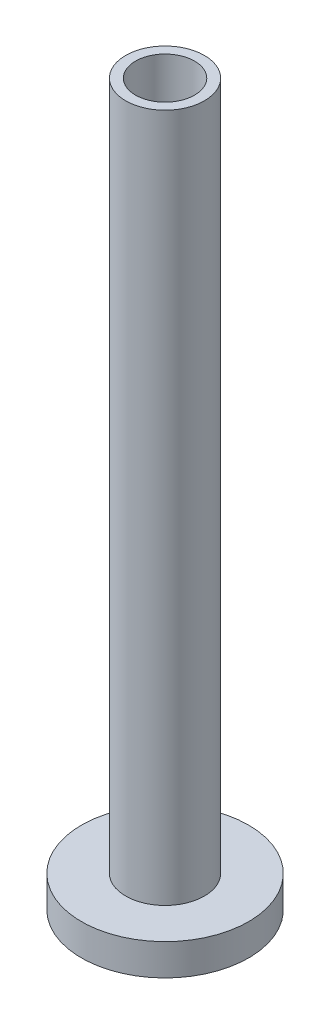
ISO-10303-21;
HEADER;
FILE_DESCRIPTION(('STEP AP214'),'2;1');
FILE_NAME('part.step','',(''),(''),'','','');
FILE_SCHEMA(('AUTOMOTIVE_DESIGN { 1 0 10303 214 1 1 1 1 }'));
ENDSEC;
DATA;
#1=APPLICATION_CONTEXT('core data for automotive mechanical design processes');
#2=APPLICATION_PROTOCOL_DEFINITION('international standard','automotive_design',2000,#1);
#3=PRODUCT_CONTEXT('',#1,'mechanical');
#4=PRODUCT('Part','Part','',(#3));
#5=PRODUCT_RELATED_PRODUCT_CATEGORY('part','',(#4));
#6=PRODUCT_DEFINITION_FORMATION('','',#4);
#7=PRODUCT_DEFINITION_CONTEXT('part definition',#1,'design');
#8=PRODUCT_DEFINITION('design','',#6,#7);
#9=PRODUCT_DEFINITION_SHAPE('','',#8);
#10=(LENGTH_UNIT() NAMED_UNIT(*) SI_UNIT(.MILLI.,.METRE.));
#11=(NAMED_UNIT(*) PLANE_ANGLE_UNIT() SI_UNIT($,.RADIAN.));
#12=(NAMED_UNIT(*) SI_UNIT($,.STERADIAN.) SOLID_ANGLE_UNIT());
#13=UNCERTAINTY_MEASURE_WITH_UNIT(LENGTH_MEASURE(1.E-05),#10,'distance_accuracy_value','');
#14=(GEOMETRIC_REPRESENTATION_CONTEXT(3) GLOBAL_UNCERTAINTY_ASSIGNED_CONTEXT((#13)) GLOBAL_UNIT_ASSIGNED_CONTEXT((#10,
#11,#12)) REPRESENTATION_CONTEXT('',''));
#15=CARTESIAN_POINT('',(0.,0.,0.));
#16=DIRECTION('',(0.,0.,1.));
#17=DIRECTION('',(1.,0.,0.));
#18=AXIS2_PLACEMENT_3D('',#15,#16,#17);
#19=CARTESIAN_POINT('',(0.,0.8,0.));
#20=DIRECTION('',(0.,-1.,0.));
#21=DIRECTION('',(0.,0.,-1.));
#22=AXIS2_PLACEMENT_3D('',#19,#20,#21);
#23=PLANE('',#22);
#24=DIRECTION('',(-0.5,0.,0.866025403784439));
#25=VECTOR('',#24,1.);
#26=CARTESIAN_POINT('',(-1.44337567297406,0.8,0.));
#27=LINE('',#26,#25);
#28=CARTESIAN_POINT('',(-1.44337567297406,0.8,0.));
#29=VERTEX_POINT('',#28);
#30=CARTESIAN_POINT('',(-0.721687836487032,0.8,-1.25));
#31=VERTEX_POINT('',#30);
#32=EDGE_CURVE('E90',#29,#31,#27,.F.);
#33=ORIENTED_EDGE('',*,*,#32,.T.);
#34=DIRECTION('',(-1.,0.,0.));
#35=VECTOR('',#34,1.);
#36=CARTESIAN_POINT('',(-0.721687836487032,0.8,-1.25));
#37=LINE('',#36,#35);
#38=CARTESIAN_POINT('',(0.721687836487033,0.8,-1.25));
#39=VERTEX_POINT('',#38);
#40=EDGE_CURVE('E132',#31,#39,#37,.F.);
#41=ORIENTED_EDGE('',*,*,#40,.T.);
#42=DIRECTION('',(-0.5,0.,-0.866025403784439));
#43=VECTOR('',#42,1.);
#44=CARTESIAN_POINT('',(0.721687836487033,0.8,-1.25));
#45=LINE('',#44,#43);
#46=CARTESIAN_POINT('',(1.44337567297406,0.8,0.));
#47=VERTEX_POINT('',#46);
#48=EDGE_CURVE('E127',#39,#47,#45,.F.);
#49=ORIENTED_EDGE('',*,*,#48,.T.);
#50=DIRECTION('',(0.5,0.,-0.866025403784439));
#51=VECTOR('',#50,1.);
#52=CARTESIAN_POINT('',(1.44337567297406,0.8,0.));
#53=LINE('',#52,#51);
#54=CARTESIAN_POINT('',(0.721687836487031,0.8,1.25));
#55=VERTEX_POINT('',#54);
#56=EDGE_CURVE('E73',#47,#55,#53,.F.);
#57=ORIENTED_EDGE('',*,*,#56,.T.);
#58=DIRECTION('',(1.,0.,0.));
#59=VECTOR('',#58,1.);
#60=CARTESIAN_POINT('',(0.72168783648703,0.8,1.25));
#61=LINE('',#60,#59);
#62=CARTESIAN_POINT('',(-0.721687836487032,0.8,1.25));
#63=VERTEX_POINT('',#62);
#64=EDGE_CURVE('E70',#55,#63,#61,.F.);
#65=ORIENTED_EDGE('',*,*,#64,.T.);
#66=DIRECTION('',(0.5,0.,0.866025403784439));
#67=VECTOR('',#66,1.);
#68=CARTESIAN_POINT('',(-0.721687836487032,0.8,1.25));
#69=LINE('',#68,#67);
#70=EDGE_CURVE('E67',#63,#29,#69,.F.);
#71=ORIENTED_EDGE('',*,*,#70,.T.);
#72=EDGE_LOOP('',(#33,#41,#49,#57,#65,#71));
#73=FACE_BOUND('',#72,.T.);
#74=ADVANCED_FACE('F16',(#73),#23,.T.);
#75=CARTESIAN_POINT('',(0.72168783648703,0.8,1.25));
#76=DIRECTION('',(0.,0.,1.));
#77=DIRECTION('',(1.,0.,0.));
#78=AXIS2_PLACEMENT_3D('',#75,#76,#77);
#79=PLANE('',#78);
#80=DIRECTION('',(0.,1.,0.));
#81=VECTOR('',#80,1.);
#82=CARTESIAN_POINT('',(-0.721687836487032,0.8,1.25));
#83=LINE('',#82,#81);
#84=CARTESIAN_POINT('',(-0.721687836487032,0.,1.25));
#85=VERTEX_POINT('',#84);
#86=EDGE_CURVE('E76',#85,#63,#83,.T.);
#87=ORIENTED_EDGE('',*,*,#86,.T.);
#88=ORIENTED_EDGE('',*,*,#64,.F.);
#89=DIRECTION('',(0.,1.,0.));
#90=VECTOR('',#89,1.);
#91=CARTESIAN_POINT('',(0.721687836487031,0.8,1.25));
#92=LINE('',#91,#90);
#93=CARTESIAN_POINT('',(0.72168783648703,0.,1.25));
#94=VERTEX_POINT('',#93);
#95=EDGE_CURVE('E122',#55,#94,#92,.F.);
#96=ORIENTED_EDGE('',*,*,#95,.T.);
#97=DIRECTION('',(1.,0.,0.));
#98=VECTOR('',#97,1.);
#99=CARTESIAN_POINT('',(0.,0.,1.25));
#100=LINE('',#99,#98);
#101=EDGE_CURVE('E81',#94,#85,#100,.F.);
#102=ORIENTED_EDGE('',*,*,#101,.T.);
#103=EDGE_LOOP('',(#87,#88,#96,#102));
#104=FACE_BOUND('',#103,.T.);
#105=ADVANCED_FACE('F79',(#104),#79,.F.);
#106=CARTESIAN_POINT('',(-0.721687836487032,0.8,1.25));
#107=DIRECTION('',(-0.866025403784439,0.,0.5));
#108=DIRECTION('',(0.5,0.,0.866025403784439));
#109=AXIS2_PLACEMENT_3D('',#106,#107,#108);
#110=PLANE('',#109);
#111=DIRECTION('',(0.,1.,0.));
#112=VECTOR('',#111,1.);
#113=CARTESIAN_POINT('',(-1.44337567297406,0.8,0.));
#114=LINE('',#113,#112);
#115=CARTESIAN_POINT('',(-1.44337567297406,0.,0.));
#116=VERTEX_POINT('',#115);
#117=EDGE_CURVE('E87',#116,#29,#114,.T.);
#118=ORIENTED_EDGE('',*,*,#117,.T.);
#119=ORIENTED_EDGE('',*,*,#70,.F.);
#120=ORIENTED_EDGE('',*,*,#86,.F.);
#121=DIRECTION('',(-0.5,0.,-0.866025403784439));
#122=VECTOR('',#121,1.);
#123=CARTESIAN_POINT('',(-0.721687836487032,0.,1.25));
#124=LINE('',#123,#122);
#125=EDGE_CURVE('E119',#85,#116,#124,.T.);
#126=ORIENTED_EDGE('',*,*,#125,.T.);
#127=EDGE_LOOP('',(#118,#119,#120,#126));
#128=FACE_BOUND('',#127,.T.);
#129=ADVANCED_FACE('F85',(#128),#110,.F.);
#130=CARTESIAN_POINT('',(-1.44337567297406,0.8,0.));
#131=DIRECTION('',(-0.866025403784439,0.,-0.5));
#132=DIRECTION('',(-0.5,0.,0.866025403784439));
#133=AXIS2_PLACEMENT_3D('',#130,#131,#132);
#134=PLANE('',#133);
#135=DIRECTION('',(0.,1.,0.));
#136=VECTOR('',#135,1.);
#137=CARTESIAN_POINT('',(-0.721687836487032,0.8,-1.25));
#138=LINE('',#137,#136);
#139=CARTESIAN_POINT('',(-0.721687836487032,0.,-1.25));
#140=VERTEX_POINT('',#139);
#141=EDGE_CURVE('E134',#140,#31,#138,.T.);
#142=ORIENTED_EDGE('',*,*,#141,.T.);
#143=ORIENTED_EDGE('',*,*,#32,.F.);
#144=ORIENTED_EDGE('',*,*,#117,.F.);
#145=DIRECTION('',(0.5,0.,-0.866025403784439));
#146=VECTOR('',#145,1.);
#147=CARTESIAN_POINT('',(-1.44337567297406,0.,0.));
#148=LINE('',#147,#146);
#149=EDGE_CURVE('E117',#116,#140,#148,.T.);
#150=ORIENTED_EDGE('',*,*,#149,.T.);
#151=EDGE_LOOP('',(#142,#143,#144,#150));
#152=FACE_BOUND('',#151,.T.);
#153=ADVANCED_FACE('F139',(#152),#134,.F.);
#154=CARTESIAN_POINT('',(-0.721687836487032,0.8,-1.25));
#155=DIRECTION('',(0.,0.,-1.));
#156=DIRECTION('',(-1.,0.,0.));
#157=AXIS2_PLACEMENT_3D('',#154,#155,#156);
#158=PLANE('',#157);
#159=DIRECTION('',(0.,1.,0.));
#160=VECTOR('',#159,1.);
#161=CARTESIAN_POINT('',(0.721687836487033,0.8,-1.25));
#162=LINE('',#161,#160);
#163=CARTESIAN_POINT('',(0.721687836487033,0.,-1.25));
#164=VERTEX_POINT('',#163);
#165=EDGE_CURVE('E129',#164,#39,#162,.T.);
#166=ORIENTED_EDGE('',*,*,#165,.T.);
#167=ORIENTED_EDGE('',*,*,#40,.F.);
#168=ORIENTED_EDGE('',*,*,#141,.F.);
#169=DIRECTION('',(1.,0.,0.));
#170=VECTOR('',#169,1.);
#171=CARTESIAN_POINT('',(0.,0.,-1.25));
#172=LINE('',#171,#170);
#173=EDGE_CURVE('E113',#140,#164,#172,.T.);
#174=ORIENTED_EDGE('',*,*,#173,.T.);
#175=EDGE_LOOP('',(#166,#167,#168,#174));
#176=FACE_BOUND('',#175,.T.);
#177=ADVANCED_FACE('F143',(#176),#158,.F.);
#178=CARTESIAN_POINT('',(0.721687836487033,0.8,-1.25));
#179=DIRECTION('',(0.866025403784439,0.,-0.5));
#180=DIRECTION('',(-0.5,0.,-0.866025403784439));
#181=AXIS2_PLACEMENT_3D('',#178,#179,#180);
#182=PLANE('',#181);
#183=DIRECTION('',(0.,1.,0.));
#184=VECTOR('',#183,1.);
#185=CARTESIAN_POINT('',(1.44337567297406,0.8,0.));
#186=LINE('',#185,#184);
#187=CARTESIAN_POINT('',(1.44337567297406,0.,0.));
#188=VERTEX_POINT('',#187);
#189=EDGE_CURVE('E125',#188,#47,#186,.T.);
#190=ORIENTED_EDGE('',*,*,#189,.T.);
#191=ORIENTED_EDGE('',*,*,#48,.F.);
#192=ORIENTED_EDGE('',*,*,#165,.F.);
#193=DIRECTION('',(0.5,0.,0.866025403784439));
#194=VECTOR('',#193,1.);
#195=CARTESIAN_POINT('',(0.721687836487033,0.,-1.25));
#196=LINE('',#195,#194);
#197=EDGE_CURVE('E34',#164,#188,#196,.T.);
#198=ORIENTED_EDGE('',*,*,#197,.T.);
#199=EDGE_LOOP('',(#190,#191,#192,#198));
#200=FACE_BOUND('',#199,.T.);
#201=ADVANCED_FACE('F145',(#200),#182,.F.);
#202=CARTESIAN_POINT('',(1.44337567297406,0.8,0.));
#203=DIRECTION('',(0.866025403784439,0.,0.5));
#204=DIRECTION('',(0.5,0.,-0.866025403784439));
#205=AXIS2_PLACEMENT_3D('',#202,#203,#204);
#206=PLANE('',#205);
#207=ORIENTED_EDGE('',*,*,#95,.F.);
#208=ORIENTED_EDGE('',*,*,#56,.F.);
#209=ORIENTED_EDGE('',*,*,#189,.F.);
#210=DIRECTION('',(-0.5,0.,0.866025403784439));
#211=VECTOR('',#210,1.);
#212=CARTESIAN_POINT('',(1.44337567297406,0.,0.));
#213=LINE('',#212,#211);
#214=EDGE_CURVE('E106',#188,#94,#213,.T.);
#215=ORIENTED_EDGE('',*,*,#214,.T.);
#216=EDGE_LOOP('',(#207,#208,#209,#215));
#217=FACE_BOUND('',#216,.T.);
#218=ADVANCED_FACE('F146',(#217),#206,.F.);
#219=CARTESIAN_POINT('',(0.,26.,0.));
#220=DIRECTION('',(0.,1.,0.));
#221=DIRECTION('',(0.,0.,1.));
#222=AXIS2_PLACEMENT_3D('',#219,#220,#221);
#223=PLANE('',#222);
#224=CARTESIAN_POINT('',(0.,26.,0.));
#225=DIRECTION('',(0.,1.,0.));
#226=DIRECTION('',(0.,0.,1.));
#227=AXIS2_PLACEMENT_3D('',#224,#225,#226);
#228=CIRCLE('',#227,1.5);
#229=CARTESIAN_POINT('',(0.,26.,1.5));
#230=VERTEX_POINT('',#229);
#231=EDGE_CURVE('E19',#230,#230,#228,.T.);
#232=ORIENTED_EDGE('',*,*,#231,.T.);
#233=EDGE_LOOP('',(#232));
#234=FACE_BOUND('',#233,.T.);
#235=ADVANCED_FACE('F148',(#234),#223,.T.);
#236=CARTESIAN_POINT('',(0.,0.,0.));
#237=DIRECTION('',(0.,1.,0.));
#238=DIRECTION('',(0.,0.,1.));
#239=AXIS2_PLACEMENT_3D('',#236,#237,#238);
#240=PLANE('',#239);
#241=CARTESIAN_POINT('',(0.,0.,0.));
#242=DIRECTION('',(0.,-1.,0.));
#243=DIRECTION('',(0.,0.,-1.));
#244=AXIS2_PLACEMENT_3D('',#241,#242,#243);
#245=CIRCLE('',#244,4.25);
#246=CARTESIAN_POINT('',(0.,0.,-4.25));
#247=VERTEX_POINT('',#246);
#248=EDGE_CURVE('E101',#247,#247,#245,.F.);
#249=ORIENTED_EDGE('',*,*,#248,.F.);
#250=EDGE_LOOP('',(#249));
#251=FACE_BOUND('',#250,.T.);
#252=ORIENTED_EDGE('',*,*,#197,.F.);
#253=ORIENTED_EDGE('',*,*,#173,.F.);
#254=ORIENTED_EDGE('',*,*,#149,.F.);
#255=ORIENTED_EDGE('',*,*,#125,.F.);
#256=ORIENTED_EDGE('',*,*,#101,.F.);
#257=ORIENTED_EDGE('',*,*,#214,.F.);
#258=EDGE_LOOP('',(#252,#253,#254,#255,#256,#257));
#259=FACE_BOUND('',#258,.T.);
#260=ADVANCED_FACE('F155',(#251,#259),#240,.F.);
#261=CARTESIAN_POINT('',(0.,26.,0.));
#262=DIRECTION('',(0.,1.,0.));
#263=DIRECTION('',(0.,0.,1.));
#264=AXIS2_PLACEMENT_3D('',#261,#262,#263);
#265=CYLINDRICAL_SURFACE('',#264,1.5);
#266=CARTESIAN_POINT('',(0.,36.6,0.));
#267=DIRECTION('',(0.,1.,0.));
#268=DIRECTION('',(0.,0.,1.));
#269=AXIS2_PLACEMENT_3D('',#266,#267,#268);
#270=CIRCLE('',#269,1.5);
#271=CARTESIAN_POINT('',(0.,36.6,1.5));
#272=VERTEX_POINT('',#271);
#273=EDGE_CURVE('E99',#272,#272,#270,.F.);
#274=ORIENTED_EDGE('',*,*,#273,.F.);
#275=EDGE_LOOP('',(#274));
#276=FACE_BOUND('',#275,.T.);
#277=ORIENTED_EDGE('',*,*,#231,.F.);
#278=EDGE_LOOP('',(#277));
#279=FACE_BOUND('',#278,.T.);
#280=ADVANCED_FACE('F177',(#276,#279),#265,.F.);
#281=CARTESIAN_POINT('',(0.,1.6,0.));
#282=DIRECTION('',(0.,-1.,0.));
#283=DIRECTION('',(0.,0.,-1.));
#284=AXIS2_PLACEMENT_3D('',#281,#282,#283);
#285=CYLINDRICAL_SURFACE('',#284,4.25);
#286=ORIENTED_EDGE('',*,*,#248,.T.);
#287=EDGE_LOOP('',(#286));
#288=FACE_BOUND('',#287,.T.);
#289=CARTESIAN_POINT('',(0.,1.6,0.));
#290=DIRECTION('',(0.,-1.,0.));
#291=DIRECTION('',(0.,0.,-1.));
#292=AXIS2_PLACEMENT_3D('',#289,#290,#291);
#293=CIRCLE('',#292,4.25);
#294=CARTESIAN_POINT('',(0.,1.6,-4.25));
#295=VERTEX_POINT('',#294);
#296=EDGE_CURVE('E96',#295,#295,#293,.F.);
#297=ORIENTED_EDGE('',*,*,#296,.F.);
#298=EDGE_LOOP('',(#297));
#299=FACE_BOUND('',#298,.T.);
#300=ADVANCED_FACE('F173',(#288,#299),#285,.T.);
#301=CARTESIAN_POINT('',(0.,36.6,0.));
#302=DIRECTION('',(0.,1.,0.));
#303=DIRECTION('',(0.,0.,1.));
#304=AXIS2_PLACEMENT_3D('',#301,#302,#303);
#305=PLANE('',#304);
#306=CARTESIAN_POINT('',(0.,36.6,0.));
#307=DIRECTION('',(0.,-1.,0.));
#308=DIRECTION('',(0.,0.,-1.));
#309=AXIS2_PLACEMENT_3D('',#306,#307,#308);
#310=CIRCLE('',#309,2.);
#311=CARTESIAN_POINT('',(0.,36.6,-2.));
#312=VERTEX_POINT('',#311);
#313=EDGE_CURVE('E25',#312,#312,#310,.T.);
#314=ORIENTED_EDGE('',*,*,#313,.F.);
#315=EDGE_LOOP('',(#314));
#316=FACE_BOUND('',#315,.T.);
#317=ORIENTED_EDGE('',*,*,#273,.T.);
#318=EDGE_LOOP('',(#317));
#319=FACE_BOUND('',#318,.T.);
#320=ADVANCED_FACE('F166',(#316,#319),#305,.T.);
#321=CARTESIAN_POINT('',(0.,1.6,0.));
#322=DIRECTION('',(0.,1.,0.));
#323=DIRECTION('',(0.,0.,1.));
#324=AXIS2_PLACEMENT_3D('',#321,#322,#323);
#325=PLANE('',#324);
#326=CARTESIAN_POINT('',(0.,1.6,0.));
#327=DIRECTION('',(0.,-1.,0.));
#328=DIRECTION('',(0.,0.,-1.));
#329=AXIS2_PLACEMENT_3D('',#326,#327,#328);
#330=CIRCLE('',#329,2.);
#331=CARTESIAN_POINT('',(0.,1.6,-2.));
#332=VERTEX_POINT('',#331);
#333=EDGE_CURVE('E11',#332,#332,#330,.F.);
#334=ORIENTED_EDGE('',*,*,#333,.F.);
#335=EDGE_LOOP('',(#334));
#336=FACE_BOUND('',#335,.T.);
#337=ORIENTED_EDGE('',*,*,#296,.T.);
#338=EDGE_LOOP('',(#337));
#339=FACE_BOUND('',#338,.T.);
#340=ADVANCED_FACE('F160',(#336,#339),#325,.T.);
#341=CARTESIAN_POINT('',(0.,36.6,0.));
#342=DIRECTION('',(0.,-1.,0.));
#343=DIRECTION('',(0.,0.,-1.));
#344=AXIS2_PLACEMENT_3D('',#341,#342,#343);
#345=CYLINDRICAL_SURFACE('',#344,2.);
#346=ORIENTED_EDGE('',*,*,#333,.T.);
#347=EDGE_LOOP('',(#346));
#348=FACE_BOUND('',#347,.T.);
#349=ORIENTED_EDGE('',*,*,#313,.T.);
#350=EDGE_LOOP('',(#349));
#351=FACE_BOUND('',#350,.T.);
#352=ADVANCED_FACE('F158',(#348,#351),#345,.T.);
#353=CLOSED_SHELL('',(#74,#105,#129,#153,#177,#201,#218,#235,#260,#280,#300,#320,#340,#352));
#354=MANIFOLD_SOLID_BREP('B1',#353);
#355=ADVANCED_BREP_SHAPE_REPRESENTATION('',(#18,#354),#14);
#356=SHAPE_DEFINITION_REPRESENTATION(#9,#355);
ENDSEC;
END-ISO-10303-21;
